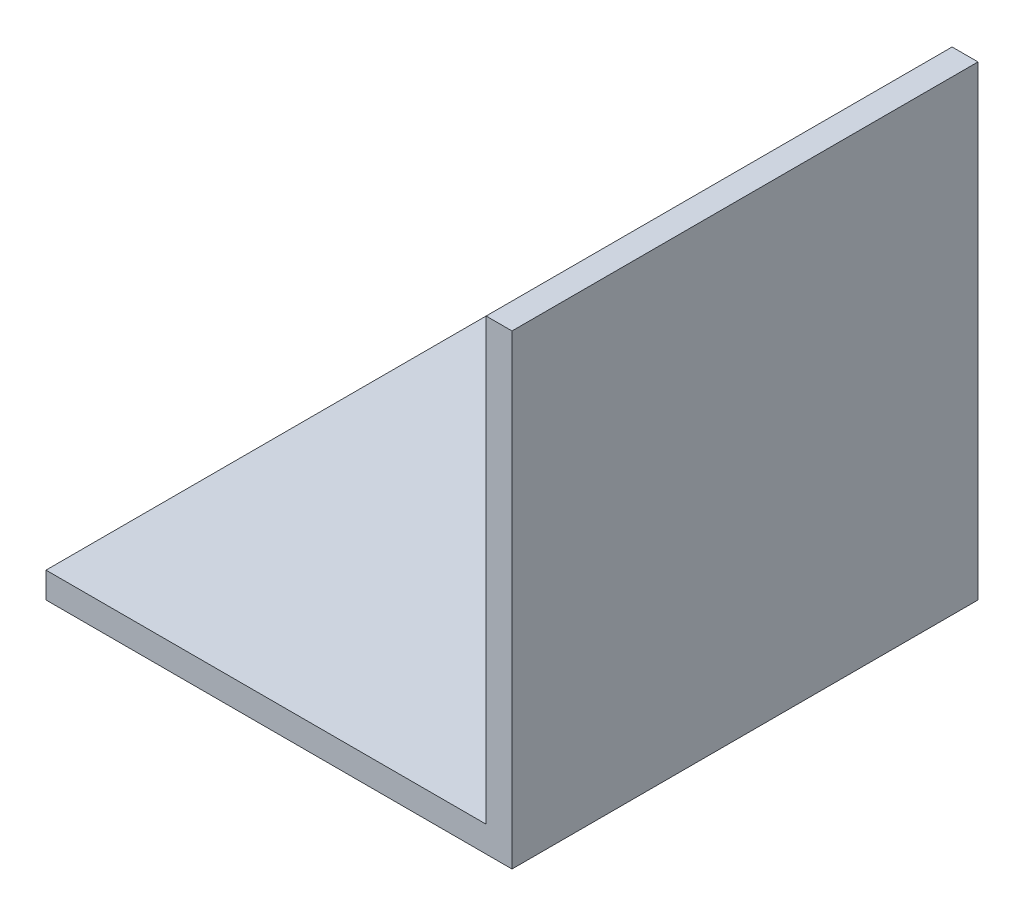
ISO-10303-21;
HEADER;
FILE_DESCRIPTION(('STEP AP214'),'2;1');
FILE_NAME('part.step','',(''),(''),'','','');
FILE_SCHEMA(('AUTOMOTIVE_DESIGN { 1 0 10303 214 1 1 1 1 }'));
ENDSEC;
DATA;
#1=APPLICATION_CONTEXT('core data for automotive mechanical design processes');
#2=APPLICATION_PROTOCOL_DEFINITION('international standard','automotive_design',2000,#1);
#3=PRODUCT_CONTEXT('',#1,'mechanical');
#4=PRODUCT('Part','Part','',(#3));
#5=PRODUCT_RELATED_PRODUCT_CATEGORY('part','',(#4));
#6=PRODUCT_DEFINITION_FORMATION('','',#4);
#7=PRODUCT_DEFINITION_CONTEXT('part definition',#1,'design');
#8=PRODUCT_DEFINITION('design','',#6,#7);
#9=PRODUCT_DEFINITION_SHAPE('','',#8);
#10=(LENGTH_UNIT() NAMED_UNIT(*) SI_UNIT(.MILLI.,.METRE.));
#11=(NAMED_UNIT(*) PLANE_ANGLE_UNIT() SI_UNIT($,.RADIAN.));
#12=(NAMED_UNIT(*) SI_UNIT($,.STERADIAN.) SOLID_ANGLE_UNIT());
#13=UNCERTAINTY_MEASURE_WITH_UNIT(LENGTH_MEASURE(1.E-05),#10,'distance_accuracy_value','');
#14=(GEOMETRIC_REPRESENTATION_CONTEXT(3) GLOBAL_UNCERTAINTY_ASSIGNED_CONTEXT((#13)) GLOBAL_UNIT_ASSIGNED_CONTEXT((#10,
#11,#12)) REPRESENTATION_CONTEXT('',''));
#15=CARTESIAN_POINT('',(0.,0.,0.));
#16=DIRECTION('',(0.,0.,1.));
#17=DIRECTION('',(1.,0.,0.));
#18=AXIS2_PLACEMENT_3D('',#15,#16,#17);
#19=CARTESIAN_POINT('',(0.,25.4,0.));
#20=DIRECTION('',(-1.,0.,0.));
#21=DIRECTION('',(0.,0.,1.));
#22=AXIS2_PLACEMENT_3D('',#19,#20,#21);
#23=PLANE('',#22);
#24=DIRECTION('',(0.,0.,-1.));
#25=VECTOR('',#24,1.);
#26=CARTESIAN_POINT('',(0.,0.,0.));
#27=LINE('',#26,#25);
#28=CARTESIAN_POINT('',(0.,0.,0.));
#29=VERTEX_POINT('',#28);
#30=CARTESIAN_POINT('',(0.,0.,-457.2));
#31=VERTEX_POINT('',#30);
#32=EDGE_CURVE('E96',#29,#31,#27,.T.);
#33=ORIENTED_EDGE('',*,*,#32,.T.);
#34=DIRECTION('',(0.,-1.,0.));
#35=VECTOR('',#34,1.);
#36=CARTESIAN_POINT('',(0.,25.4,-457.2));
#37=LINE('',#36,#35);
#38=CARTESIAN_POINT('',(0.,457.2,-457.2));
#39=VERTEX_POINT('',#38);
#40=EDGE_CURVE('E11',#39,#31,#37,.T.);
#41=ORIENTED_EDGE('',*,*,#40,.F.);
#42=DIRECTION('',(0.,0.,-1.));
#43=VECTOR('',#42,1.);
#44=CARTESIAN_POINT('',(0.,457.2,-457.2));
#45=LINE('',#44,#43);
#46=CARTESIAN_POINT('',(0.,457.2,0.));
#47=VERTEX_POINT('',#46);
#48=EDGE_CURVE('E98',#47,#39,#45,.T.);
#49=ORIENTED_EDGE('',*,*,#48,.F.);
#50=DIRECTION('',(0.,-1.,0.));
#51=VECTOR('',#50,1.);
#52=CARTESIAN_POINT('',(0.,25.4,0.));
#53=LINE('',#52,#51);
#54=EDGE_CURVE('E82',#47,#29,#53,.T.);
#55=ORIENTED_EDGE('',*,*,#54,.T.);
#56=EDGE_LOOP('',(#33,#41,#49,#55));
#57=FACE_BOUND('',#56,.T.);
#58=ADVANCED_FACE('F37',(#57),#23,.F.);
#59=CARTESIAN_POINT('',(0.,25.4,-457.2));
#60=DIRECTION('',(0.,0.,1.));
#61=DIRECTION('',(1.,0.,0.));
#62=AXIS2_PLACEMENT_3D('',#59,#60,#61);
#63=PLANE('',#62);
#64=DIRECTION('',(-1.,0.,0.));
#65=VECTOR('',#64,1.);
#66=CARTESIAN_POINT('',(0.,0.,-457.2));
#67=LINE('',#66,#65);
#68=CARTESIAN_POINT('',(-457.2,0.,-457.2));
#69=VERTEX_POINT('',#68);
#70=EDGE_CURVE('E103',#31,#69,#67,.T.);
#71=ORIENTED_EDGE('',*,*,#70,.T.);
#72=DIRECTION('',(0.,-1.,0.));
#73=VECTOR('',#72,1.);
#74=CARTESIAN_POINT('',(-457.2,25.4,-457.2));
#75=LINE('',#74,#73);
#76=CARTESIAN_POINT('',(-457.2,25.4,-457.2));
#77=VERTEX_POINT('',#76);
#78=EDGE_CURVE('E44',#77,#69,#75,.T.);
#79=ORIENTED_EDGE('',*,*,#78,.F.);
#80=DIRECTION('',(-1.,0.,0.));
#81=VECTOR('',#80,1.);
#82=CARTESIAN_POINT('',(0.,25.4,-457.2));
#83=LINE('',#82,#81);
#84=CARTESIAN_POINT('',(-25.4,25.4,-457.2));
#85=VERTEX_POINT('',#84);
#86=EDGE_CURVE('E89',#85,#77,#83,.T.);
#87=ORIENTED_EDGE('',*,*,#86,.F.);
#88=DIRECTION('',(0.,-1.,0.));
#89=VECTOR('',#88,1.);
#90=CARTESIAN_POINT('',(-25.4000000000001,457.2,-457.2));
#91=LINE('',#90,#89);
#92=CARTESIAN_POINT('',(-25.4000000000001,457.2,-457.2));
#93=VERTEX_POINT('',#92);
#94=EDGE_CURVE('E109',#93,#85,#91,.T.);
#95=ORIENTED_EDGE('',*,*,#94,.F.);
#96=DIRECTION('',(-1.,0.,0.));
#97=VECTOR('',#96,1.);
#98=CARTESIAN_POINT('',(-25.4000000000001,457.2,-457.2));
#99=LINE('',#98,#97);
#100=EDGE_CURVE('E126',#39,#93,#99,.T.);
#101=ORIENTED_EDGE('',*,*,#100,.F.);
#102=ORIENTED_EDGE('',*,*,#40,.T.);
#103=EDGE_LOOP('',(#71,#79,#87,#95,#101,#102));
#104=FACE_BOUND('',#103,.T.);
#105=ADVANCED_FACE('F120',(#104),#63,.F.);
#106=CARTESIAN_POINT('',(-457.2,25.4,0.));
#107=DIRECTION('',(1.,0.,0.));
#108=DIRECTION('',(0.,0.,-1.));
#109=AXIS2_PLACEMENT_3D('',#106,#107,#108);
#110=PLANE('',#109);
#111=DIRECTION('',(0.,0.,1.));
#112=VECTOR('',#111,1.);
#113=CARTESIAN_POINT('',(-457.2,0.,0.));
#114=LINE('',#113,#112);
#115=CARTESIAN_POINT('',(-457.2,0.,0.));
#116=VERTEX_POINT('',#115);
#117=EDGE_CURVE('E90',#69,#116,#114,.T.);
#118=ORIENTED_EDGE('',*,*,#117,.T.);
#119=DIRECTION('',(0.,-1.,0.));
#120=VECTOR('',#119,1.);
#121=CARTESIAN_POINT('',(-457.2,25.4,0.));
#122=LINE('',#121,#120);
#123=CARTESIAN_POINT('',(-457.2,25.4,0.));
#124=VERTEX_POINT('',#123);
#125=EDGE_CURVE('E85',#124,#116,#122,.T.);
#126=ORIENTED_EDGE('',*,*,#125,.F.);
#127=DIRECTION('',(0.,0.,1.));
#128=VECTOR('',#127,1.);
#129=CARTESIAN_POINT('',(-457.2,25.4,0.));
#130=LINE('',#129,#128);
#131=EDGE_CURVE('E57',#77,#124,#130,.T.);
#132=ORIENTED_EDGE('',*,*,#131,.F.);
#133=ORIENTED_EDGE('',*,*,#78,.T.);
#134=EDGE_LOOP('',(#118,#126,#132,#133));
#135=FACE_BOUND('',#134,.T.);
#136=ADVANCED_FACE('F118',(#135),#110,.F.);
#137=CARTESIAN_POINT('',(0.,25.4,0.));
#138=DIRECTION('',(0.,0.,-1.));
#139=DIRECTION('',(-1.,0.,0.));
#140=AXIS2_PLACEMENT_3D('',#137,#138,#139);
#141=PLANE('',#140);
#142=DIRECTION('',(1.,0.,0.));
#143=VECTOR('',#142,1.);
#144=CARTESIAN_POINT('',(0.,0.,0.));
#145=LINE('',#144,#143);
#146=EDGE_CURVE('E77',#116,#29,#145,.T.);
#147=ORIENTED_EDGE('',*,*,#146,.T.);
#148=ORIENTED_EDGE('',*,*,#54,.F.);
#149=DIRECTION('',(1.,0.,0.));
#150=VECTOR('',#149,1.);
#151=CARTESIAN_POINT('',(-25.4,457.2,0.));
#152=LINE('',#151,#150);
#153=CARTESIAN_POINT('',(-25.4,457.2,0.));
#154=VERTEX_POINT('',#153);
#155=EDGE_CURVE('E131',#154,#47,#152,.T.);
#156=ORIENTED_EDGE('',*,*,#155,.F.);
#157=DIRECTION('',(0.,-1.,0.));
#158=VECTOR('',#157,1.);
#159=CARTESIAN_POINT('',(-25.4,457.2,0.));
#160=LINE('',#159,#158);
#161=CARTESIAN_POINT('',(-25.4,25.4,0.));
#162=VERTEX_POINT('',#161);
#163=EDGE_CURVE('E104',#154,#162,#160,.T.);
#164=ORIENTED_EDGE('',*,*,#163,.T.);
#165=DIRECTION('',(1.,0.,0.));
#166=VECTOR('',#165,1.);
#167=CARTESIAN_POINT('',(0.,25.4,0.));
#168=LINE('',#167,#166);
#169=EDGE_CURVE('E100',#124,#162,#168,.T.);
#170=ORIENTED_EDGE('',*,*,#169,.F.);
#171=ORIENTED_EDGE('',*,*,#125,.T.);
#172=EDGE_LOOP('',(#147,#148,#156,#164,#170,#171));
#173=FACE_BOUND('',#172,.T.);
#174=ADVANCED_FACE('F79',(#173),#141,.F.);
#175=CARTESIAN_POINT('',(0.,25.4,0.));
#176=DIRECTION('',(0.,1.,0.));
#177=DIRECTION('',(0.,0.,1.));
#178=AXIS2_PLACEMENT_3D('',#175,#176,#177);
#179=PLANE('',#178);
#180=DIRECTION('',(0.,0.,1.));
#181=VECTOR('',#180,1.);
#182=CARTESIAN_POINT('',(-25.4000000000001,25.4,-457.2));
#183=LINE('',#182,#181);
#184=EDGE_CURVE('E51',#85,#162,#183,.T.);
#185=ORIENTED_EDGE('',*,*,#184,.F.);
#186=ORIENTED_EDGE('',*,*,#86,.T.);
#187=ORIENTED_EDGE('',*,*,#131,.T.);
#188=ORIENTED_EDGE('',*,*,#169,.T.);
#189=EDGE_LOOP('',(#185,#186,#187,#188));
#190=FACE_BOUND('',#189,.T.);
#191=ADVANCED_FACE('F141',(#190),#179,.T.);
#192=CARTESIAN_POINT('',(0.,0.,0.));
#193=DIRECTION('',(0.,1.,0.));
#194=DIRECTION('',(0.,0.,1.));
#195=AXIS2_PLACEMENT_3D('',#192,#193,#194);
#196=PLANE('',#195);
#197=ORIENTED_EDGE('',*,*,#32,.F.);
#198=ORIENTED_EDGE('',*,*,#146,.F.);
#199=ORIENTED_EDGE('',*,*,#117,.F.);
#200=ORIENTED_EDGE('',*,*,#70,.F.);
#201=EDGE_LOOP('',(#197,#198,#199,#200));
#202=FACE_BOUND('',#201,.T.);
#203=ADVANCED_FACE('F102',(#202),#196,.F.);
#204=CARTESIAN_POINT('',(-25.4000000000001,457.2,-457.2));
#205=DIRECTION('',(1.,0.,0.));
#206=DIRECTION('',(0.,0.,-1.));
#207=AXIS2_PLACEMENT_3D('',#204,#205,#206);
#208=PLANE('',#207);
#209=ORIENTED_EDGE('',*,*,#184,.T.);
#210=ORIENTED_EDGE('',*,*,#163,.F.);
#211=DIRECTION('',(0.,0.,1.));
#212=VECTOR('',#211,1.);
#213=CARTESIAN_POINT('',(-25.4000000000001,457.2,-457.2));
#214=LINE('',#213,#212);
#215=EDGE_CURVE('E134',#93,#154,#214,.T.);
#216=ORIENTED_EDGE('',*,*,#215,.F.);
#217=ORIENTED_EDGE('',*,*,#94,.T.);
#218=EDGE_LOOP('',(#209,#210,#216,#217));
#219=FACE_BOUND('',#218,.T.);
#220=ADVANCED_FACE('F146',(#219),#208,.F.);
#221=CARTESIAN_POINT('',(0.,457.2,0.));
#222=DIRECTION('',(0.,1.,0.));
#223=DIRECTION('',(0.,0.,1.));
#224=AXIS2_PLACEMENT_3D('',#221,#222,#223);
#225=PLANE('',#224);
#226=ORIENTED_EDGE('',*,*,#215,.T.);
#227=ORIENTED_EDGE('',*,*,#155,.T.);
#228=ORIENTED_EDGE('',*,*,#48,.T.);
#229=ORIENTED_EDGE('',*,*,#100,.T.);
#230=EDGE_LOOP('',(#226,#227,#228,#229));
#231=FACE_BOUND('',#230,.T.);
#232=ADVANCED_FACE('F130',(#231),#225,.T.);
#233=CLOSED_SHELL('',(#58,#105,#136,#174,#191,#203,#220,#232));
#234=MANIFOLD_SOLID_BREP('B2',#233);
#235=ADVANCED_BREP_SHAPE_REPRESENTATION('',(#18,#234),#14);
#236=SHAPE_DEFINITION_REPRESENTATION(#9,#235);
ENDSEC;
END-ISO-10303-21;
